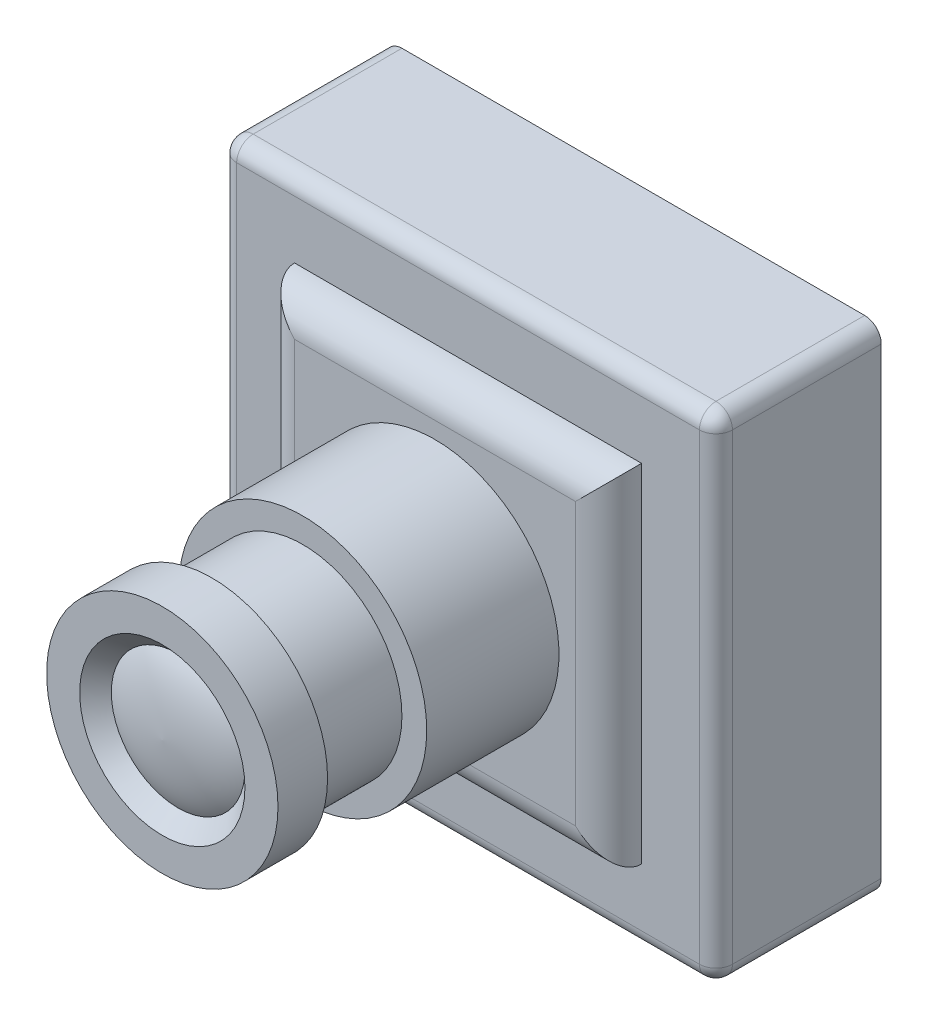
ISO-10303-21;
HEADER;
FILE_DESCRIPTION(('STEP AP214'),'2;1');
FILE_NAME('part.step','',(''),(''),'','','');
FILE_SCHEMA(('AUTOMOTIVE_DESIGN { 1 0 10303 214 1 1 1 1 }'));
ENDSEC;
DATA;
#1=APPLICATION_CONTEXT('core data for automotive mechanical design processes');
#2=APPLICATION_PROTOCOL_DEFINITION('international standard','automotive_design',2000,#1);
#3=PRODUCT_CONTEXT('',#1,'mechanical');
#4=PRODUCT('Part','Part','',(#3));
#5=PRODUCT_RELATED_PRODUCT_CATEGORY('part','',(#4));
#6=PRODUCT_DEFINITION_FORMATION('','',#4);
#7=PRODUCT_DEFINITION_CONTEXT('part definition',#1,'design');
#8=PRODUCT_DEFINITION('design','',#6,#7);
#9=PRODUCT_DEFINITION_SHAPE('','',#8);
#10=(LENGTH_UNIT() NAMED_UNIT(*) SI_UNIT(.MILLI.,.METRE.));
#11=(NAMED_UNIT(*) PLANE_ANGLE_UNIT() SI_UNIT($,.RADIAN.));
#12=(NAMED_UNIT(*) SI_UNIT($,.STERADIAN.) SOLID_ANGLE_UNIT());
#13=UNCERTAINTY_MEASURE_WITH_UNIT(LENGTH_MEASURE(1.E-05),#10,'distance_accuracy_value','');
#14=(GEOMETRIC_REPRESENTATION_CONTEXT(3) GLOBAL_UNCERTAINTY_ASSIGNED_CONTEXT((#13)) GLOBAL_UNIT_ASSIGNED_CONTEXT((#10,
#11,#12)) REPRESENTATION_CONTEXT('',''));
#15=CARTESIAN_POINT('',(0.,0.,0.));
#16=DIRECTION('',(0.,0.,1.));
#17=DIRECTION('',(1.,0.,0.));
#18=AXIS2_PLACEMENT_3D('',#15,#16,#17);
#19=CARTESIAN_POINT('',(0.,0.,25.5));
#20=DIRECTION('',(0.,0.,1.));
#21=DIRECTION('',(1.,0.,0.));
#22=AXIS2_PLACEMENT_3D('',#19,#20,#21);
#23=CONICAL_SURFACE('',#22,1.99999999999997,0.785398163397454);
#24=CARTESIAN_POINT('',(0.,0.,28.5));
#25=DIRECTION('',(0.,0.,1.));
#26=DIRECTION('',(1.,0.,0.));
#27=AXIS2_PLACEMENT_3D('',#24,#25,#26);
#28=CIRCLE('',#27,5.);
#29=CARTESIAN_POINT('',(5.,0.,28.5));
#30=VERTEX_POINT('',#29);
#31=EDGE_CURVE('E236',#30,#30,#28,.T.);
#32=ORIENTED_EDGE('',*,*,#31,.T.);
#33=EDGE_LOOP('',(#32));
#34=FACE_BOUND('',#33,.T.);
#35=CARTESIAN_POINT('',(0.,0.,27.542045048619));
#36=DIRECTION('',(0.,0.,1.));
#37=DIRECTION('',(0.,-1.,0.));
#38=AXIS2_PLACEMENT_3D('',#35,#36,#37);
#39=CIRCLE('',#38,4.04204504861898);
#40=CARTESIAN_POINT('',(0.,-4.04204504861898,27.542045048619));
#41=VERTEX_POINT('',#40);
#42=EDGE_CURVE('E148',#41,#41,#39,.T.);
#43=ORIENTED_EDGE('',*,*,#42,.F.);
#44=EDGE_LOOP('',(#43));
#45=FACE_BOUND('',#44,.T.);
#46=ADVANCED_FACE('F36',(#34,#45),#23,.F.);
#47=CARTESIAN_POINT('',(0.,0.,20.));
#48=DIRECTION('',(0.,0.,1.));
#49=DIRECTION('',(1.,0.,0.));
#50=AXIS2_PLACEMENT_3D('',#47,#48,#49);
#51=PLANE('',#50);
#52=CARTESIAN_POINT('',(0.,0.,20.));
#53=DIRECTION('',(0.,0.,1.));
#54=DIRECTION('',(1.,0.,0.));
#55=AXIS2_PLACEMENT_3D('',#52,#53,#54);
#56=CIRCLE('',#55,7.5);
#57=CARTESIAN_POINT('',(7.5,0.,20.));
#58=VERTEX_POINT('',#57);
#59=EDGE_CURVE('E640',#58,#58,#56,.T.);
#60=ORIENTED_EDGE('',*,*,#59,.T.);
#61=EDGE_LOOP('',(#60));
#62=FACE_BOUND('',#61,.T.);
#63=CARTESIAN_POINT('',(0.,0.,20.));
#64=DIRECTION('',(0.,0.,1.));
#65=DIRECTION('',(1.,0.,0.));
#66=AXIS2_PLACEMENT_3D('',#63,#64,#65);
#67=CIRCLE('',#66,6.);
#68=CARTESIAN_POINT('',(6.,0.,20.));
#69=VERTEX_POINT('',#68);
#70=EDGE_CURVE('E634',#69,#69,#67,.T.);
#71=ORIENTED_EDGE('',*,*,#70,.F.);
#72=EDGE_LOOP('',(#71));
#73=FACE_BOUND('',#72,.T.);
#74=ADVANCED_FACE('F354',(#62,#73),#51,.T.);
#75=CARTESIAN_POINT('',(-10.5,10.5,12.));
#76=DIRECTION('',(0.,0.,-1.));
#77=DIRECTION('',(-1.,0.,0.));
#78=AXIS2_PLACEMENT_3D('',#75,#76,#77);
#79=PLANE('',#78);
#80=DIRECTION('',(0.,-1.,0.));
#81=VECTOR('',#80,1.);
#82=CARTESIAN_POINT('',(-8.5,10.5,12.));
#83=LINE('',#82,#81);
#84=CARTESIAN_POINT('',(-8.5,8.5,12.));
#85=VERTEX_POINT('',#84);
#86=CARTESIAN_POINT('',(-8.5,-8.5,12.));
#87=VERTEX_POINT('',#86);
#88=EDGE_CURVE('E199',#85,#87,#83,.T.);
#89=ORIENTED_EDGE('',*,*,#88,.T.);
#90=DIRECTION('',(1.,0.,0.));
#91=VECTOR('',#90,1.);
#92=CARTESIAN_POINT('',(-10.5,-8.5,12.));
#93=LINE('',#92,#91);
#94=CARTESIAN_POINT('',(8.5,-8.5,12.));
#95=VERTEX_POINT('',#94);
#96=EDGE_CURVE('E11',#87,#95,#93,.T.);
#97=ORIENTED_EDGE('',*,*,#96,.T.);
#98=DIRECTION('',(0.,1.,0.));
#99=VECTOR('',#98,1.);
#100=CARTESIAN_POINT('',(8.5,10.5,12.));
#101=LINE('',#100,#99);
#102=CARTESIAN_POINT('',(8.5,8.5,12.));
#103=VERTEX_POINT('',#102);
#104=EDGE_CURVE('E45',#95,#103,#101,.T.);
#105=ORIENTED_EDGE('',*,*,#104,.T.);
#106=DIRECTION('',(-1.,0.,0.));
#107=VECTOR('',#106,1.);
#108=CARTESIAN_POINT('',(-10.5,8.5,12.));
#109=LINE('',#108,#107);
#110=EDGE_CURVE('E238',#103,#85,#109,.T.);
#111=ORIENTED_EDGE('',*,*,#110,.T.);
#112=EDGE_LOOP('',(#89,#97,#105,#111));
#113=FACE_BOUND('',#112,.T.);
#114=CARTESIAN_POINT('',(0.,0.,12.));
#115=DIRECTION('',(0.,0.,-1.));
#116=DIRECTION('',(-1.,0.,0.));
#117=AXIS2_PLACEMENT_3D('',#114,#115,#116);
#118=CIRCLE('',#117,7.5);
#119=CARTESIAN_POINT('',(-7.5,0.,12.));
#120=VERTEX_POINT('',#119);
#121=EDGE_CURVE('E151',#120,#120,#118,.F.);
#122=ORIENTED_EDGE('',*,*,#121,.F.);
#123=EDGE_LOOP('',(#122));
#124=FACE_BOUND('',#123,.T.);
#125=ADVANCED_FACE('F360',(#113,#124),#79,.F.);
#126=CARTESIAN_POINT('',(-15.,-15.,10.));
#127=DIRECTION('',(0.,0.,-1.));
#128=DIRECTION('',(-1.,0.,0.));
#129=AXIS2_PLACEMENT_3D('',#126,#127,#128);
#130=PLANE('',#129);
#131=DIRECTION('',(1.,0.,0.));
#132=VECTOR('',#131,1.);
#133=CARTESIAN_POINT('',(-15.,-14.,10.));
#134=LINE('',#133,#132);
#135=CARTESIAN_POINT('',(-14.,-14.,10.));
#136=VERTEX_POINT('',#135);
#137=CARTESIAN_POINT('',(14.,-14.,10.));
#138=VERTEX_POINT('',#137);
#139=EDGE_CURVE('E194',#136,#138,#134,.T.);
#140=ORIENTED_EDGE('',*,*,#139,.T.);
#141=DIRECTION('',(0.,1.,0.));
#142=VECTOR('',#141,1.);
#143=CARTESIAN_POINT('',(14.,-15.,10.));
#144=LINE('',#143,#142);
#145=CARTESIAN_POINT('',(14.,14.,10.));
#146=VERTEX_POINT('',#145);
#147=EDGE_CURVE('E196',#138,#146,#144,.T.);
#148=ORIENTED_EDGE('',*,*,#147,.T.);
#149=DIRECTION('',(-1.,0.,0.));
#150=VECTOR('',#149,1.);
#151=CARTESIAN_POINT('',(-15.,14.,10.));
#152=LINE('',#151,#150);
#153=CARTESIAN_POINT('',(-14.,14.,10.));
#154=VERTEX_POINT('',#153);
#155=EDGE_CURVE('E190',#146,#154,#152,.T.);
#156=ORIENTED_EDGE('',*,*,#155,.T.);
#157=DIRECTION('',(0.,-1.,0.));
#158=VECTOR('',#157,1.);
#159=CARTESIAN_POINT('',(-14.,-15.,10.));
#160=LINE('',#159,#158);
#161=EDGE_CURVE('E192',#154,#136,#160,.T.);
#162=ORIENTED_EDGE('',*,*,#161,.T.);
#163=EDGE_LOOP('',(#140,#148,#156,#162));
#164=FACE_BOUND('',#163,.T.);
#165=DIRECTION('',(0.,-1.,0.));
#166=VECTOR('',#165,1.);
#167=CARTESIAN_POINT('',(-10.5,-10.5,10.));
#168=LINE('',#167,#166);
#169=CARTESIAN_POINT('',(-10.5,10.5,10.));
#170=VERTEX_POINT('',#169);
#171=CARTESIAN_POINT('',(-10.5,-10.5,10.));
#172=VERTEX_POINT('',#171);
#173=EDGE_CURVE('E255',#170,#172,#168,.T.);
#174=ORIENTED_EDGE('',*,*,#173,.F.);
#175=DIRECTION('',(-1.,0.,0.));
#176=VECTOR('',#175,1.);
#177=CARTESIAN_POINT('',(-10.5,10.5,10.));
#178=LINE('',#177,#176);
#179=CARTESIAN_POINT('',(10.5,10.5,10.));
#180=VERTEX_POINT('',#179);
#181=EDGE_CURVE('E259',#180,#170,#178,.T.);
#182=ORIENTED_EDGE('',*,*,#181,.F.);
#183=DIRECTION('',(0.,1.,0.));
#184=VECTOR('',#183,1.);
#185=CARTESIAN_POINT('',(10.5,-10.5,10.));
#186=LINE('',#185,#184);
#187=CARTESIAN_POINT('',(10.5,-10.5,10.));
#188=VERTEX_POINT('',#187);
#189=EDGE_CURVE('E262',#188,#180,#186,.T.);
#190=ORIENTED_EDGE('',*,*,#189,.F.);
#191=DIRECTION('',(1.,0.,0.));
#192=VECTOR('',#191,1.);
#193=CARTESIAN_POINT('',(-10.5,-10.5,10.));
#194=LINE('',#193,#192);
#195=EDGE_CURVE('E267',#172,#188,#194,.T.);
#196=ORIENTED_EDGE('',*,*,#195,.F.);
#197=EDGE_LOOP('',(#174,#182,#190,#196));
#198=FACE_BOUND('',#197,.T.);
#199=ADVANCED_FACE('F342',(#164,#198),#130,.F.);
#200=CARTESIAN_POINT('',(-15.,-15.,10.));
#201=DIRECTION('',(1.,0.,0.));
#202=DIRECTION('',(0.,1.,0.));
#203=AXIS2_PLACEMENT_3D('',#200,#201,#202);
#204=PLANE('',#203);
#205=DIRECTION('',(0.,-1.,0.));
#206=VECTOR('',#205,1.);
#207=CARTESIAN_POINT('',(-15.,-15.,0.));
#208=LINE('',#207,#206);
#209=CARTESIAN_POINT('',(-15.,14.,0.));
#210=VERTEX_POINT('',#209);
#211=CARTESIAN_POINT('',(-15.,-14.,0.));
#212=VERTEX_POINT('',#211);
#213=EDGE_CURVE('E261',#210,#212,#208,.T.);
#214=ORIENTED_EDGE('',*,*,#213,.T.);
#215=DIRECTION('',(0.,0.,-1.));
#216=VECTOR('',#215,1.);
#217=CARTESIAN_POINT('',(-15.,-14.,10.));
#218=LINE('',#217,#216);
#219=CARTESIAN_POINT('',(-15.,-14.,9.));
#220=VERTEX_POINT('',#219);
#221=EDGE_CURVE('E176',#212,#220,#218,.F.);
#222=ORIENTED_EDGE('',*,*,#221,.T.);
#223=DIRECTION('',(0.,-1.,0.));
#224=VECTOR('',#223,1.);
#225=CARTESIAN_POINT('',(-15.,-15.,9.));
#226=LINE('',#225,#224);
#227=CARTESIAN_POINT('',(-15.,14.,9.));
#228=VERTEX_POINT('',#227);
#229=EDGE_CURVE('E172',#220,#228,#226,.F.);
#230=ORIENTED_EDGE('',*,*,#229,.T.);
#231=DIRECTION('',(0.,0.,-1.));
#232=VECTOR('',#231,1.);
#233=CARTESIAN_POINT('',(-15.,14.,10.));
#234=LINE('',#233,#232);
#235=EDGE_CURVE('E174',#228,#210,#234,.T.);
#236=ORIENTED_EDGE('',*,*,#235,.T.);
#237=EDGE_LOOP('',(#214,#222,#230,#236));
#238=FACE_BOUND('',#237,.T.);
#239=ADVANCED_FACE('F331',(#238),#204,.F.);
#240=CARTESIAN_POINT('',(-15.,-15.,10.));
#241=DIRECTION('',(0.,1.,0.));
#242=DIRECTION('',(0.,0.,1.));
#243=AXIS2_PLACEMENT_3D('',#240,#241,#242);
#244=PLANE('',#243);
#245=DIRECTION('',(1.,0.,0.));
#246=VECTOR('',#245,1.);
#247=CARTESIAN_POINT('',(-15.,-15.,9.));
#248=LINE('',#247,#246);
#249=CARTESIAN_POINT('',(14.,-15.,9.));
#250=VERTEX_POINT('',#249);
#251=CARTESIAN_POINT('',(-14.,-15.,9.));
#252=VERTEX_POINT('',#251);
#253=EDGE_CURVE('E150',#250,#252,#248,.F.);
#254=ORIENTED_EDGE('',*,*,#253,.T.);
#255=DIRECTION('',(0.,0.,-1.));
#256=VECTOR('',#255,1.);
#257=CARTESIAN_POINT('',(-14.,-15.,10.));
#258=LINE('',#257,#256);
#259=CARTESIAN_POINT('',(-14.,-15.,0.));
#260=VERTEX_POINT('',#259);
#261=EDGE_CURVE('E161',#252,#260,#258,.T.);
#262=ORIENTED_EDGE('',*,*,#261,.T.);
#263=DIRECTION('',(1.,0.,0.));
#264=VECTOR('',#263,1.);
#265=CARTESIAN_POINT('',(-15.,-15.,0.));
#266=LINE('',#265,#264);
#267=CARTESIAN_POINT('',(14.,-15.,0.));
#268=VERTEX_POINT('',#267);
#269=EDGE_CURVE('E265',#260,#268,#266,.T.);
#270=ORIENTED_EDGE('',*,*,#269,.T.);
#271=DIRECTION('',(0.,0.,-1.));
#272=VECTOR('',#271,1.);
#273=CARTESIAN_POINT('',(14.,-15.,10.));
#274=LINE('',#273,#272);
#275=EDGE_CURVE('E153',#268,#250,#274,.F.);
#276=ORIENTED_EDGE('',*,*,#275,.T.);
#277=EDGE_LOOP('',(#254,#262,#270,#276));
#278=FACE_BOUND('',#277,.T.);
#279=ADVANCED_FACE('F321',(#278),#244,.F.);
#280=CARTESIAN_POINT('',(15.,-15.,10.));
#281=DIRECTION('',(-1.,0.,0.));
#282=DIRECTION('',(0.,-1.,0.));
#283=AXIS2_PLACEMENT_3D('',#280,#281,#282);
#284=PLANE('',#283);
#285=DIRECTION('',(0.,1.,0.));
#286=VECTOR('',#285,1.);
#287=CARTESIAN_POINT('',(15.,-15.,0.));
#288=LINE('',#287,#286);
#289=CARTESIAN_POINT('',(15.,-14.,0.));
#290=VERTEX_POINT('',#289);
#291=CARTESIAN_POINT('',(15.,14.,0.));
#292=VERTEX_POINT('',#291);
#293=EDGE_CURVE('E273',#290,#292,#288,.T.);
#294=ORIENTED_EDGE('',*,*,#293,.T.);
#295=DIRECTION('',(0.,0.,-1.));
#296=VECTOR('',#295,1.);
#297=CARTESIAN_POINT('',(15.,14.,10.));
#298=LINE('',#297,#296);
#299=CARTESIAN_POINT('',(15.,14.,9.));
#300=VERTEX_POINT('',#299);
#301=EDGE_CURVE('E188',#292,#300,#298,.F.);
#302=ORIENTED_EDGE('',*,*,#301,.T.);
#303=DIRECTION('',(0.,1.,0.));
#304=VECTOR('',#303,1.);
#305=CARTESIAN_POINT('',(15.,-15.,9.));
#306=LINE('',#305,#304);
#307=CARTESIAN_POINT('',(15.,-14.,9.));
#308=VERTEX_POINT('',#307);
#309=EDGE_CURVE('E184',#300,#308,#306,.F.);
#310=ORIENTED_EDGE('',*,*,#309,.T.);
#311=DIRECTION('',(0.,0.,-1.));
#312=VECTOR('',#311,1.);
#313=CARTESIAN_POINT('',(15.,-14.,10.));
#314=LINE('',#313,#312);
#315=EDGE_CURVE('E186',#308,#290,#314,.T.);
#316=ORIENTED_EDGE('',*,*,#315,.T.);
#317=EDGE_LOOP('',(#294,#302,#310,#316));
#318=FACE_BOUND('',#317,.T.);
#319=ADVANCED_FACE('F310',(#318),#284,.F.);
#320=CARTESIAN_POINT('',(-15.,15.,10.));
#321=DIRECTION('',(0.,-1.,0.));
#322=DIRECTION('',(0.,0.,-1.));
#323=AXIS2_PLACEMENT_3D('',#320,#321,#322);
#324=PLANE('',#323);
#325=DIRECTION('',(-1.,0.,0.));
#326=VECTOR('',#325,1.);
#327=CARTESIAN_POINT('',(-15.,15.,0.));
#328=LINE('',#327,#326);
#329=CARTESIAN_POINT('',(14.,15.,0.));
#330=VERTEX_POINT('',#329);
#331=CARTESIAN_POINT('',(-14.,15.,0.));
#332=VERTEX_POINT('',#331);
#333=EDGE_CURVE('E156',#330,#332,#328,.T.);
#334=ORIENTED_EDGE('',*,*,#333,.T.);
#335=DIRECTION('',(0.,0.,-1.));
#336=VECTOR('',#335,1.);
#337=CARTESIAN_POINT('',(-14.,15.,10.));
#338=LINE('',#337,#336);
#339=CARTESIAN_POINT('',(-14.,15.,9.));
#340=VERTEX_POINT('',#339);
#341=EDGE_CURVE('E182',#332,#340,#338,.F.);
#342=ORIENTED_EDGE('',*,*,#341,.T.);
#343=DIRECTION('',(-1.,0.,0.));
#344=VECTOR('',#343,1.);
#345=CARTESIAN_POINT('',(-15.,15.,9.));
#346=LINE('',#345,#344);
#347=CARTESIAN_POINT('',(14.,15.,9.));
#348=VERTEX_POINT('',#347);
#349=EDGE_CURVE('E178',#340,#348,#346,.F.);
#350=ORIENTED_EDGE('',*,*,#349,.T.);
#351=DIRECTION('',(0.,0.,-1.));
#352=VECTOR('',#351,1.);
#353=CARTESIAN_POINT('',(14.,15.,10.));
#354=LINE('',#353,#352);
#355=EDGE_CURVE('E180',#348,#330,#354,.T.);
#356=ORIENTED_EDGE('',*,*,#355,.T.);
#357=EDGE_LOOP('',(#334,#342,#350,#356));
#358=FACE_BOUND('',#357,.T.);
#359=ADVANCED_FACE('F279',(#358),#324,.F.);
#360=CARTESIAN_POINT('',(-15.,-15.,0.));
#361=DIRECTION('',(0.,0.,-1.));
#362=DIRECTION('',(-1.,0.,0.));
#363=AXIS2_PLACEMENT_3D('',#360,#361,#362);
#364=PLANE('',#363);
#365=ORIENTED_EDGE('',*,*,#269,.F.);
#366=CARTESIAN_POINT('',(-14.,-14.,0.));
#367=DIRECTION('',(0.,0.,-1.));
#368=DIRECTION('',(-1.,0.,0.));
#369=AXIS2_PLACEMENT_3D('',#366,#367,#368);
#370=CIRCLE('',#369,1.);
#371=EDGE_CURVE('E170',#260,#212,#370,.T.);
#372=ORIENTED_EDGE('',*,*,#371,.T.);
#373=ORIENTED_EDGE('',*,*,#213,.F.);
#374=CARTESIAN_POINT('',(-14.,14.,0.));
#375=DIRECTION('',(0.,0.,-1.));
#376=DIRECTION('',(-1.,0.,0.));
#377=AXIS2_PLACEMENT_3D('',#374,#375,#376);
#378=CIRCLE('',#377,1.);
#379=EDGE_CURVE('E168',#210,#332,#378,.T.);
#380=ORIENTED_EDGE('',*,*,#379,.T.);
#381=ORIENTED_EDGE('',*,*,#333,.F.);
#382=CARTESIAN_POINT('',(14.,14.,0.));
#383=DIRECTION('',(0.,0.,-1.));
#384=DIRECTION('',(-1.,0.,0.));
#385=AXIS2_PLACEMENT_3D('',#382,#383,#384);
#386=CIRCLE('',#385,1.);
#387=EDGE_CURVE('E166',#330,#292,#386,.T.);
#388=ORIENTED_EDGE('',*,*,#387,.T.);
#389=ORIENTED_EDGE('',*,*,#293,.F.);
#390=CARTESIAN_POINT('',(14.,-14.,0.));
#391=DIRECTION('',(0.,0.,-1.));
#392=DIRECTION('',(-1.,0.,0.));
#393=AXIS2_PLACEMENT_3D('',#390,#391,#392);
#394=CIRCLE('',#393,1.);
#395=EDGE_CURVE('E164',#290,#268,#394,.T.);
#396=ORIENTED_EDGE('',*,*,#395,.T.);
#397=EDGE_LOOP('',(#365,#372,#373,#380,#381,#388,#389,#396));
#398=FACE_BOUND('',#397,.T.);
#399=ADVANCED_FACE('F319',(#398),#364,.T.);
#400=CARTESIAN_POINT('',(0.,0.,20.));
#401=DIRECTION('',(0.,0.,-1.));
#402=DIRECTION('',(-1.,0.,0.));
#403=AXIS2_PLACEMENT_3D('',#400,#401,#402);
#404=CYLINDRICAL_SURFACE('',#403,7.5);
#405=ORIENTED_EDGE('',*,*,#59,.F.);
#406=EDGE_LOOP('',(#405));
#407=FACE_BOUND('',#406,.T.);
#408=ORIENTED_EDGE('',*,*,#121,.T.);
#409=EDGE_LOOP('',(#408));
#410=FACE_BOUND('',#409,.T.);
#411=ADVANCED_FACE('F568',(#407,#410),#404,.T.);
#412=CARTESIAN_POINT('',(0.,0.,25.5));
#413=DIRECTION('',(0.,0.,-1.));
#414=DIRECTION('',(-1.,0.,0.));
#415=AXIS2_PLACEMENT_3D('',#412,#413,#414);
#416=CYLINDRICAL_SURFACE('',#415,6.);
#417=CARTESIAN_POINT('',(0.,0.,25.5));
#418=DIRECTION('',(0.,0.,1.));
#419=DIRECTION('',(1.,0.,0.));
#420=AXIS2_PLACEMENT_3D('',#417,#418,#419);
#421=CIRCLE('',#420,6.);
#422=CARTESIAN_POINT('',(6.,0.,25.5));
#423=VERTEX_POINT('',#422);
#424=EDGE_CURVE('E637',#423,#423,#421,.T.);
#425=ORIENTED_EDGE('',*,*,#424,.F.);
#426=EDGE_LOOP('',(#425));
#427=FACE_BOUND('',#426,.T.);
#428=ORIENTED_EDGE('',*,*,#70,.T.);
#429=EDGE_LOOP('',(#428));
#430=FACE_BOUND('',#429,.T.);
#431=ADVANCED_FACE('F559',(#427,#430),#416,.T.);
#432=CARTESIAN_POINT('',(0.,0.,25.5));
#433=DIRECTION('',(0.,0.,1.));
#434=DIRECTION('',(1.,0.,0.));
#435=AXIS2_PLACEMENT_3D('',#432,#433,#434);
#436=PLANE('',#435);
#437=CARTESIAN_POINT('',(0.,0.,25.5));
#438=DIRECTION('',(0.,0.,1.));
#439=DIRECTION('',(1.,0.,0.));
#440=AXIS2_PLACEMENT_3D('',#437,#438,#439);
#441=CIRCLE('',#440,7.);
#442=CARTESIAN_POINT('',(7.,0.,25.5));
#443=VERTEX_POINT('',#442);
#444=EDGE_CURVE('E630',#443,#443,#441,.T.);
#445=ORIENTED_EDGE('',*,*,#444,.F.);
#446=EDGE_LOOP('',(#445));
#447=FACE_BOUND('',#446,.T.);
#448=ORIENTED_EDGE('',*,*,#424,.T.);
#449=EDGE_LOOP('',(#448));
#450=FACE_BOUND('',#449,.T.);
#451=ADVANCED_FACE('F550',(#447,#450),#436,.F.);
#452=CARTESIAN_POINT('',(0.,0.,28.5));
#453=DIRECTION('',(0.,0.,-1.));
#454=DIRECTION('',(-1.,0.,0.));
#455=AXIS2_PLACEMENT_3D('',#452,#453,#454);
#456=CYLINDRICAL_SURFACE('',#455,7.);
#457=CARTESIAN_POINT('',(0.,0.,28.5));
#458=DIRECTION('',(0.,0.,1.));
#459=DIRECTION('',(1.,0.,0.));
#460=AXIS2_PLACEMENT_3D('',#457,#458,#459);
#461=CIRCLE('',#460,7.);
#462=CARTESIAN_POINT('',(7.,0.,28.5));
#463=VERTEX_POINT('',#462);
#464=EDGE_CURVE('E631',#463,#463,#461,.T.);
#465=ORIENTED_EDGE('',*,*,#464,.F.);
#466=EDGE_LOOP('',(#465));
#467=FACE_BOUND('',#466,.T.);
#468=ORIENTED_EDGE('',*,*,#444,.T.);
#469=EDGE_LOOP('',(#468));
#470=FACE_BOUND('',#469,.T.);
#471=ADVANCED_FACE('F542',(#467,#470),#456,.T.);
#472=CARTESIAN_POINT('',(0.,0.,28.5));
#473=DIRECTION('',(0.,0.,1.));
#474=DIRECTION('',(1.,0.,0.));
#475=AXIS2_PLACEMENT_3D('',#472,#473,#474);
#476=PLANE('',#475);
#477=ORIENTED_EDGE('',*,*,#31,.F.);
#478=EDGE_LOOP('',(#477));
#479=FACE_BOUND('',#478,.T.);
#480=ORIENTED_EDGE('',*,*,#464,.T.);
#481=EDGE_LOOP('',(#480));
#482=FACE_BOUND('',#481,.T.);
#483=ADVANCED_FACE('F144',(#479,#482),#476,.T.);
#484=CARTESIAN_POINT('',(0.,6.,25.5));
#485=CARTESIAN_POINT('',(0.,4.87576544023222,27.0798783715957));
#486=CARTESIAN_POINT('',(0.,3.96243650238156,28.3292863325061));
#487=CARTESIAN_POINT('',(0.,0.,28.5));
#488=B_SPLINE_CURVE_WITH_KNOTS('',3,(#484,#485,#486,#487),.UNSPECIFIED.,.F.,.F.,(4,4),(0.,1.),.UNSPECIFIED.);
#489=CARTESIAN_POINT('',(0.,0.,28.5));
#490=DIRECTION('',(0.,0.,1.));
#491=AXIS1_PLACEMENT('',#489,#490);
#492=SURFACE_OF_REVOLUTION('',#488,#491);
#493=CARTESIAN_POINT('',(0.,0.,28.5));
#494=VERTEX_POINT('',#493);
#495=VERTEX_LOOP('',#494);
#496=FACE_BOUND('',#495,.T.);
#497=ORIENTED_EDGE('',*,*,#42,.T.);
#498=EDGE_LOOP('',(#497));
#499=FACE_BOUND('',#498,.T.);
#500=ADVANCED_FACE('F140',(#496,#499),#492,.T.);
#501=CARTESIAN_POINT('',(14.,14.,10.));
#502=DIRECTION('',(0.,0.,-1.));
#503=DIRECTION('',(-1.,0.,0.));
#504=AXIS2_PLACEMENT_3D('',#501,#502,#503);
#505=CYLINDRICAL_SURFACE('',#504,1.);
#506=CARTESIAN_POINT('',(14.,14.,9.));
#507=DIRECTION('',(0.,0.,1.));
#508=DIRECTION('',(1.,0.,0.));
#509=AXIS2_PLACEMENT_3D('',#506,#507,#508);
#510=CIRCLE('',#509,1.);
#511=EDGE_CURVE('E233',#300,#348,#510,.T.);
#512=ORIENTED_EDGE('',*,*,#511,.F.);
#513=ORIENTED_EDGE('',*,*,#301,.F.);
#514=ORIENTED_EDGE('',*,*,#387,.F.);
#515=ORIENTED_EDGE('',*,*,#355,.F.);
#516=EDGE_LOOP('',(#512,#513,#514,#515));
#517=FACE_BOUND('',#516,.T.);
#518=ADVANCED_FACE('F143',(#517),#505,.T.);
#519=CARTESIAN_POINT('',(14.,14.,9.));
#520=DIRECTION('',(0.,0.,1.));
#521=DIRECTION('',(1.,0.,0.));
#522=AXIS2_PLACEMENT_3D('',#519,#520,#521);
#523=SPHERICAL_SURFACE('',#522,1.);
#524=CARTESIAN_POINT('',(14.,14.,9.));
#525=DIRECTION('',(0.,1.,0.));
#526=DIRECTION('',(0.,0.,1.));
#527=AXIS2_PLACEMENT_3D('',#524,#525,#526);
#528=CIRCLE('',#527,1.);
#529=EDGE_CURVE('E227',#300,#146,#528,.F.);
#530=ORIENTED_EDGE('',*,*,#529,.F.);
#531=ORIENTED_EDGE('',*,*,#511,.T.);
#532=CARTESIAN_POINT('',(14.,14.,9.));
#533=DIRECTION('',(1.,0.,0.));
#534=DIRECTION('',(0.,0.,-1.));
#535=AXIS2_PLACEMENT_3D('',#532,#533,#534);
#536=CIRCLE('',#535,1.);
#537=EDGE_CURVE('E230',#146,#348,#536,.F.);
#538=ORIENTED_EDGE('',*,*,#537,.F.);
#539=EDGE_LOOP('',(#530,#531,#538));
#540=FACE_BOUND('',#539,.T.);
#541=ADVANCED_FACE('F302',(#540),#523,.T.);
#542=CARTESIAN_POINT('',(-14.,14.,10.));
#543=DIRECTION('',(0.,0.,-1.));
#544=DIRECTION('',(-1.,0.,0.));
#545=AXIS2_PLACEMENT_3D('',#542,#543,#544);
#546=CYLINDRICAL_SURFACE('',#545,1.);
#547=ORIENTED_EDGE('',*,*,#379,.F.);
#548=ORIENTED_EDGE('',*,*,#235,.F.);
#549=CARTESIAN_POINT('',(-14.,14.,9.));
#550=DIRECTION('',(0.,0.,1.));
#551=DIRECTION('',(1.,0.,0.));
#552=AXIS2_PLACEMENT_3D('',#549,#550,#551);
#553=CIRCLE('',#552,1.);
#554=EDGE_CURVE('E224',#340,#228,#553,.T.);
#555=ORIENTED_EDGE('',*,*,#554,.F.);
#556=ORIENTED_EDGE('',*,*,#341,.F.);
#557=EDGE_LOOP('',(#547,#548,#555,#556));
#558=FACE_BOUND('',#557,.T.);
#559=ADVANCED_FACE('F287',(#558),#546,.T.);
#560=CARTESIAN_POINT('',(-15.,14.,9.));
#561=DIRECTION('',(-1.,0.,0.));
#562=DIRECTION('',(0.,0.,1.));
#563=AXIS2_PLACEMENT_3D('',#560,#561,#562);
#564=CYLINDRICAL_SURFACE('',#563,1.);
#565=ORIENTED_EDGE('',*,*,#537,.T.);
#566=ORIENTED_EDGE('',*,*,#349,.F.);
#567=CARTESIAN_POINT('',(-14.,14.,9.));
#568=DIRECTION('',(-1.,0.,0.));
#569=DIRECTION('',(0.,0.,1.));
#570=AXIS2_PLACEMENT_3D('',#567,#568,#569);
#571=CIRCLE('',#570,1.);
#572=EDGE_CURVE('E221',#154,#340,#571,.T.);
#573=ORIENTED_EDGE('',*,*,#572,.F.);
#574=ORIENTED_EDGE('',*,*,#155,.F.);
#575=EDGE_LOOP('',(#565,#566,#573,#574));
#576=FACE_BOUND('',#575,.T.);
#577=ADVANCED_FACE('F295',(#576),#564,.T.);
#578=CARTESIAN_POINT('',(14.,-15.,9.));
#579=DIRECTION('',(0.,1.,0.));
#580=DIRECTION('',(-1.,0.,0.));
#581=AXIS2_PLACEMENT_3D('',#578,#579,#580);
#582=CYLINDRICAL_SURFACE('',#581,1.);
#583=ORIENTED_EDGE('',*,*,#529,.T.);
#584=ORIENTED_EDGE('',*,*,#147,.F.);
#585=CARTESIAN_POINT('',(14.,-14.,9.));
#586=DIRECTION('',(0.,-1.,0.));
#587=DIRECTION('',(0.,0.,-1.));
#588=AXIS2_PLACEMENT_3D('',#585,#586,#587);
#589=CIRCLE('',#588,1.);
#590=EDGE_CURVE('E218',#308,#138,#589,.T.);
#591=ORIENTED_EDGE('',*,*,#590,.F.);
#592=ORIENTED_EDGE('',*,*,#309,.F.);
#593=EDGE_LOOP('',(#583,#584,#591,#592));
#594=FACE_BOUND('',#593,.T.);
#595=ADVANCED_FACE('F307',(#594),#582,.T.);
#596=CARTESIAN_POINT('',(14.,-14.,10.));
#597=DIRECTION('',(0.,0.,-1.));
#598=DIRECTION('',(-1.,0.,0.));
#599=AXIS2_PLACEMENT_3D('',#596,#597,#598);
#600=CYLINDRICAL_SURFACE('',#599,1.);
#601=ORIENTED_EDGE('',*,*,#395,.F.);
#602=ORIENTED_EDGE('',*,*,#315,.F.);
#603=CARTESIAN_POINT('',(14.,-14.,9.));
#604=DIRECTION('',(0.,0.,1.));
#605=DIRECTION('',(1.,0.,0.));
#606=AXIS2_PLACEMENT_3D('',#603,#604,#605);
#607=CIRCLE('',#606,1.);
#608=EDGE_CURVE('E215',#250,#308,#607,.T.);
#609=ORIENTED_EDGE('',*,*,#608,.F.);
#610=ORIENTED_EDGE('',*,*,#275,.F.);
#611=EDGE_LOOP('',(#601,#602,#609,#610));
#612=FACE_BOUND('',#611,.T.);
#613=ADVANCED_FACE('F315',(#612),#600,.T.);
#614=CARTESIAN_POINT('',(-14.,14.,9.));
#615=DIRECTION('',(0.,0.,1.));
#616=DIRECTION('',(1.,0.,0.));
#617=AXIS2_PLACEMENT_3D('',#614,#615,#616);
#618=SPHERICAL_SURFACE('',#617,1.);
#619=ORIENTED_EDGE('',*,*,#572,.T.);
#620=ORIENTED_EDGE('',*,*,#554,.T.);
#621=CARTESIAN_POINT('',(-14.,14.,9.));
#622=DIRECTION('',(0.,1.,0.));
#623=DIRECTION('',(0.,0.,1.));
#624=AXIS2_PLACEMENT_3D('',#621,#622,#623);
#625=CIRCLE('',#624,1.);
#626=EDGE_CURVE('E212',#154,#228,#625,.F.);
#627=ORIENTED_EDGE('',*,*,#626,.F.);
#628=EDGE_LOOP('',(#619,#620,#627));
#629=FACE_BOUND('',#628,.T.);
#630=ADVANCED_FACE('F292',(#629),#618,.T.);
#631=CARTESIAN_POINT('',(14.,-14.,9.));
#632=DIRECTION('',(0.,0.,1.));
#633=DIRECTION('',(1.,0.,0.));
#634=AXIS2_PLACEMENT_3D('',#631,#632,#633);
#635=SPHERICAL_SURFACE('',#634,1.);
#636=ORIENTED_EDGE('',*,*,#608,.T.);
#637=ORIENTED_EDGE('',*,*,#590,.T.);
#638=CARTESIAN_POINT('',(14.,-14.,9.));
#639=DIRECTION('',(1.,0.,0.));
#640=DIRECTION('',(0.,1.,0.));
#641=AXIS2_PLACEMENT_3D('',#638,#639,#640);
#642=CIRCLE('',#641,1.);
#643=EDGE_CURVE('E209',#250,#138,#642,.F.);
#644=ORIENTED_EDGE('',*,*,#643,.F.);
#645=EDGE_LOOP('',(#636,#637,#644));
#646=FACE_BOUND('',#645,.T.);
#647=ADVANCED_FACE('F344',(#646),#635,.T.);
#648=CARTESIAN_POINT('',(-14.,-15.,9.));
#649=DIRECTION('',(0.,-1.,0.));
#650=DIRECTION('',(1.,0.,0.));
#651=AXIS2_PLACEMENT_3D('',#648,#649,#650);
#652=CYLINDRICAL_SURFACE('',#651,1.);
#653=ORIENTED_EDGE('',*,*,#626,.T.);
#654=ORIENTED_EDGE('',*,*,#229,.F.);
#655=CARTESIAN_POINT('',(-14.,-14.,9.));
#656=DIRECTION('',(0.,-1.,0.));
#657=DIRECTION('',(0.,0.,-1.));
#658=AXIS2_PLACEMENT_3D('',#655,#656,#657);
#659=CIRCLE('',#658,1.);
#660=EDGE_CURVE('E206',#136,#220,#659,.T.);
#661=ORIENTED_EDGE('',*,*,#660,.F.);
#662=ORIENTED_EDGE('',*,*,#161,.F.);
#663=EDGE_LOOP('',(#653,#654,#661,#662));
#664=FACE_BOUND('',#663,.T.);
#665=ADVANCED_FACE('F335',(#664),#652,.T.);
#666=CARTESIAN_POINT('',(-15.,-14.,9.));
#667=DIRECTION('',(1.,0.,0.));
#668=DIRECTION('',(0.,0.,-1.));
#669=AXIS2_PLACEMENT_3D('',#666,#667,#668);
#670=CYLINDRICAL_SURFACE('',#669,1.);
#671=ORIENTED_EDGE('',*,*,#643,.T.);
#672=ORIENTED_EDGE('',*,*,#139,.F.);
#673=CARTESIAN_POINT('',(-14.,-14.,9.));
#674=DIRECTION('',(-1.,0.,0.));
#675=DIRECTION('',(0.,0.,1.));
#676=AXIS2_PLACEMENT_3D('',#673,#674,#675);
#677=CIRCLE('',#676,1.);
#678=EDGE_CURVE('E203',#252,#136,#677,.T.);
#679=ORIENTED_EDGE('',*,*,#678,.F.);
#680=ORIENTED_EDGE('',*,*,#253,.F.);
#681=EDGE_LOOP('',(#671,#672,#679,#680));
#682=FACE_BOUND('',#681,.T.);
#683=ADVANCED_FACE('F340',(#682),#670,.T.);
#684=CARTESIAN_POINT('',(-14.,-14.,9.));
#685=DIRECTION('',(0.,0.,1.));
#686=DIRECTION('',(1.,0.,0.));
#687=AXIS2_PLACEMENT_3D('',#684,#685,#686);
#688=SPHERICAL_SURFACE('',#687,1.);
#689=ORIENTED_EDGE('',*,*,#678,.T.);
#690=ORIENTED_EDGE('',*,*,#660,.T.);
#691=CARTESIAN_POINT('',(-14.,-14.,9.));
#692=DIRECTION('',(0.,0.,1.));
#693=DIRECTION('',(1.,0.,0.));
#694=AXIS2_PLACEMENT_3D('',#691,#692,#693);
#695=CIRCLE('',#694,1.);
#696=EDGE_CURVE('E200',#252,#220,#695,.F.);
#697=ORIENTED_EDGE('',*,*,#696,.F.);
#698=EDGE_LOOP('',(#689,#690,#697));
#699=FACE_BOUND('',#698,.T.);
#700=ADVANCED_FACE('F337',(#699),#688,.T.);
#701=CARTESIAN_POINT('',(-14.,-14.,10.));
#702=DIRECTION('',(0.,0.,-1.));
#703=DIRECTION('',(-1.,0.,0.));
#704=AXIS2_PLACEMENT_3D('',#701,#702,#703);
#705=CYLINDRICAL_SURFACE('',#704,1.);
#706=ORIENTED_EDGE('',*,*,#696,.T.);
#707=ORIENTED_EDGE('',*,*,#221,.F.);
#708=ORIENTED_EDGE('',*,*,#371,.F.);
#709=ORIENTED_EDGE('',*,*,#261,.F.);
#710=EDGE_LOOP('',(#706,#707,#708,#709));
#711=FACE_BOUND('',#710,.T.);
#712=ADVANCED_FACE('F326',(#711),#705,.T.);
#713=CARTESIAN_POINT('',(-10.5,8.5,10.));
#714=DIRECTION('',(-1.,0.,0.));
#715=DIRECTION('',(0.,0.,1.));
#716=AXIS2_PLACEMENT_3D('',#713,#714,#715);
#717=CYLINDRICAL_SURFACE('',#716,2.);
#718=CARTESIAN_POINT('',(8.5,8.5,10.));
#719=DIRECTION('',(-0.707106781186547,0.707106781186547,0.));
#720=DIRECTION('',(-0.707106781186547,-0.707106781186548,0.));
#721=AXIS2_PLACEMENT_3D('',#718,#719,#720);
#722=ELLIPSE('',#721,2.82842712474619,2.);
#723=EDGE_CURVE('E243',#180,#103,#722,.F.);
#724=ORIENTED_EDGE('',*,*,#723,.F.);
#725=ORIENTED_EDGE('',*,*,#181,.T.);
#726=CARTESIAN_POINT('',(-8.5,8.5,10.));
#727=DIRECTION('',(-0.707106781186547,-0.707106781186548,0.));
#728=DIRECTION('',(0.707106781186547,-0.707106781186547,0.));
#729=AXIS2_PLACEMENT_3D('',#726,#727,#728);
#730=ELLIPSE('',#729,2.82842712474619,2.);
#731=EDGE_CURVE('E40',#85,#170,#730,.T.);
#732=ORIENTED_EDGE('',*,*,#731,.F.);
#733=ORIENTED_EDGE('',*,*,#110,.F.);
#734=EDGE_LOOP('',(#724,#725,#732,#733));
#735=FACE_BOUND('',#734,.T.);
#736=ADVANCED_FACE('F38',(#735),#717,.T.);
#737=CARTESIAN_POINT('',(-8.5,10.5,10.));
#738=DIRECTION('',(0.,-1.,0.));
#739=DIRECTION('',(1.,0.,0.));
#740=AXIS2_PLACEMENT_3D('',#737,#738,#739);
#741=CYLINDRICAL_SURFACE('',#740,2.);
#742=ORIENTED_EDGE('',*,*,#731,.T.);
#743=ORIENTED_EDGE('',*,*,#173,.T.);
#744=CARTESIAN_POINT('',(-8.5,-8.5,10.));
#745=DIRECTION('',(0.707106781186547,-0.707106781186547,0.));
#746=DIRECTION('',(-0.707106781186547,-0.707106781186548,0.));
#747=AXIS2_PLACEMENT_3D('',#744,#745,#746);
#748=ELLIPSE('',#747,2.82842712474619,2.);
#749=EDGE_CURVE('E242',#87,#172,#748,.T.);
#750=ORIENTED_EDGE('',*,*,#749,.F.);
#751=ORIENTED_EDGE('',*,*,#88,.F.);
#752=EDGE_LOOP('',(#742,#743,#750,#751));
#753=FACE_BOUND('',#752,.T.);
#754=ADVANCED_FACE('F253',(#753),#741,.T.);
#755=CARTESIAN_POINT('',(8.5,10.5,10.));
#756=DIRECTION('',(0.,1.,0.));
#757=DIRECTION('',(-1.,0.,0.));
#758=AXIS2_PLACEMENT_3D('',#755,#756,#757);
#759=CYLINDRICAL_SURFACE('',#758,2.);
#760=ORIENTED_EDGE('',*,*,#723,.T.);
#761=ORIENTED_EDGE('',*,*,#104,.F.);
#762=CARTESIAN_POINT('',(8.5,-8.5,10.));
#763=DIRECTION('',(0.707106781186547,0.707106781186548,0.));
#764=DIRECTION('',(-0.707106781186547,0.707106781186547,0.));
#765=AXIS2_PLACEMENT_3D('',#762,#763,#764);
#766=ELLIPSE('',#765,2.82842712474619,2.);
#767=EDGE_CURVE('E53',#188,#95,#766,.F.);
#768=ORIENTED_EDGE('',*,*,#767,.F.);
#769=ORIENTED_EDGE('',*,*,#189,.T.);
#770=EDGE_LOOP('',(#760,#761,#768,#769));
#771=FACE_BOUND('',#770,.T.);
#772=ADVANCED_FACE('F397',(#771),#759,.T.);
#773=CARTESIAN_POINT('',(-10.5,-8.5,10.));
#774=DIRECTION('',(1.,0.,0.));
#775=DIRECTION('',(0.,0.,-1.));
#776=AXIS2_PLACEMENT_3D('',#773,#774,#775);
#777=CYLINDRICAL_SURFACE('',#776,2.);
#778=ORIENTED_EDGE('',*,*,#749,.T.);
#779=ORIENTED_EDGE('',*,*,#195,.T.);
#780=ORIENTED_EDGE('',*,*,#767,.T.);
#781=ORIENTED_EDGE('',*,*,#96,.F.);
#782=EDGE_LOOP('',(#778,#779,#780,#781));
#783=FACE_BOUND('',#782,.T.);
#784=ADVANCED_FACE('F403',(#783),#777,.T.);
#785=CLOSED_SHELL('',(#46,#74,#125,#199,#239,#279,#319,#359,#399,#411,#431,#451,#471,#483,#500,
#518,#541,#559,#577,#595,#613,#630,#647,#665,#683,#700,#712,#736,#754,#772,#784));
#786=MANIFOLD_SOLID_BREP('B2',#785);
#787=ADVANCED_BREP_SHAPE_REPRESENTATION('',(#18,#786),#14);
#788=SHAPE_DEFINITION_REPRESENTATION(#9,#787);
ENDSEC;
END-ISO-10303-21;
